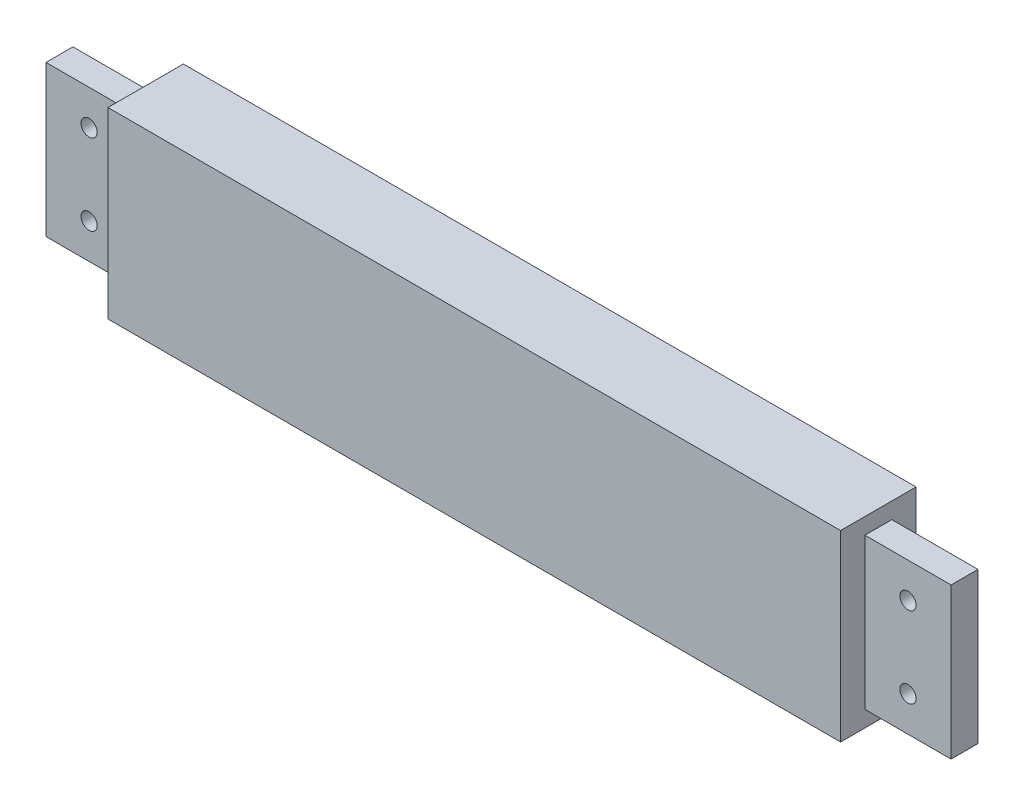
ISO-10303-21;
HEADER;
FILE_DESCRIPTION(('STEP AP214'),'2;1');
FILE_NAME('part.step','',(''),(''),'','','');
FILE_SCHEMA(('AUTOMOTIVE_DESIGN { 1 0 10303 214 1 1 1 1 }'));
ENDSEC;
DATA;
#1=APPLICATION_CONTEXT('core data for automotive mechanical design processes');
#2=APPLICATION_PROTOCOL_DEFINITION('international standard','automotive_design',2000,#1);
#3=PRODUCT_CONTEXT('',#1,'mechanical');
#4=PRODUCT('Part','Part','',(#3));
#5=PRODUCT_RELATED_PRODUCT_CATEGORY('part','',(#4));
#6=PRODUCT_DEFINITION_FORMATION('','',#4);
#7=PRODUCT_DEFINITION_CONTEXT('part definition',#1,'design');
#8=PRODUCT_DEFINITION('design','',#6,#7);
#9=PRODUCT_DEFINITION_SHAPE('','',#8);
#10=(LENGTH_UNIT() NAMED_UNIT(*) SI_UNIT(.MILLI.,.METRE.));
#11=(NAMED_UNIT(*) PLANE_ANGLE_UNIT() SI_UNIT($,.RADIAN.));
#12=(NAMED_UNIT(*) SI_UNIT($,.STERADIAN.) SOLID_ANGLE_UNIT());
#13=UNCERTAINTY_MEASURE_WITH_UNIT(LENGTH_MEASURE(1.E-05),#10,'distance_accuracy_value','');
#14=(GEOMETRIC_REPRESENTATION_CONTEXT(3) GLOBAL_UNCERTAINTY_ASSIGNED_CONTEXT((#13)) GLOBAL_UNIT_ASSIGNED_CONTEXT((#10,
#11,#12)) REPRESENTATION_CONTEXT('',''));
#15=CARTESIAN_POINT('',(0.,0.,0.));
#16=DIRECTION('',(0.,0.,1.));
#17=DIRECTION('',(1.,0.,0.));
#18=AXIS2_PLACEMENT_3D('',#15,#16,#17);
#19=CARTESIAN_POINT('',(0.,0.,-22.225));
#20=DIRECTION('',(0.,0.,-1.));
#21=DIRECTION('',(-1.,0.,0.));
#22=AXIS2_PLACEMENT_3D('',#19,#20,#21);
#23=PLANE('',#22);
#24=DIRECTION('',(1.,0.,0.));
#25=VECTOR('',#24,1.);
#26=CARTESIAN_POINT('',(-215.9,19.05,-22.225));
#27=LINE('',#26,#25);
#28=CARTESIAN_POINT('',(-215.9,19.05,-22.225));
#29=VERTEX_POINT('',#28);
#30=CARTESIAN_POINT('',(215.9,19.05,-22.225));
#31=VERTEX_POINT('',#30);
#32=EDGE_CURVE('E207',#29,#31,#27,.T.);
#33=ORIENTED_EDGE('',*,*,#32,.T.);
#34=DIRECTION('',(0.,1.,0.));
#35=VECTOR('',#34,1.);
#36=CARTESIAN_POINT('',(215.9,53.975,-22.225));
#37=LINE('',#36,#35);
#38=CARTESIAN_POINT('',(215.9,-53.975,-22.225));
#39=VERTEX_POINT('',#38);
#40=EDGE_CURVE('E272',#39,#31,#37,.T.);
#41=ORIENTED_EDGE('',*,*,#40,.F.);
#42=DIRECTION('',(1.,0.,0.));
#43=VECTOR('',#42,1.);
#44=CARTESIAN_POINT('',(215.9,-53.975,-22.225));
#45=LINE('',#44,#43);
#46=CARTESIAN_POINT('',(-215.9,-53.975,-22.225));
#47=VERTEX_POINT('',#46);
#48=EDGE_CURVE('E269',#47,#39,#45,.T.);
#49=ORIENTED_EDGE('',*,*,#48,.F.);
#50=DIRECTION('',(0.,-1.,0.));
#51=VECTOR('',#50,1.);
#52=CARTESIAN_POINT('',(-215.9,53.975,-22.225));
#53=LINE('',#52,#51);
#54=EDGE_CURVE('E254',#29,#47,#53,.T.);
#55=ORIENTED_EDGE('',*,*,#54,.F.);
#56=EDGE_LOOP('',(#33,#41,#49,#55));
#57=FACE_BOUND('',#56,.T.);
#58=ADVANCED_FACE('F33',(#57),#23,.T.);
#59=CARTESIAN_POINT('',(215.9,53.975,22.225));
#60=DIRECTION('',(-1.,0.,0.));
#61=DIRECTION('',(0.,0.,1.));
#62=AXIS2_PLACEMENT_3D('',#59,#60,#61);
#63=PLANE('',#62);
#64=ORIENTED_EDGE('',*,*,#40,.T.);
#65=DIRECTION('',(0.,0.,-1.));
#66=VECTOR('',#65,1.);
#67=CARTESIAN_POINT('',(215.9,19.05,-19.05));
#68=LINE('',#67,#66);
#69=CARTESIAN_POINT('',(215.9,19.05,-19.05));
#70=VERTEX_POINT('',#69);
#71=EDGE_CURVE('E194',#70,#31,#68,.T.);
#72=ORIENTED_EDGE('',*,*,#71,.F.);
#73=DIRECTION('',(0.,-1.,0.));
#74=VECTOR('',#73,1.);
#75=CARTESIAN_POINT('',(215.9,28.575,-19.05));
#76=LINE('',#75,#74);
#77=CARTESIAN_POINT('',(215.9,28.575,-19.05));
#78=VERTEX_POINT('',#77);
#79=EDGE_CURVE('E203',#78,#70,#76,.T.);
#80=ORIENTED_EDGE('',*,*,#79,.F.);
#81=DIRECTION('',(0.,0.,1.));
#82=VECTOR('',#81,1.);
#83=CARTESIAN_POINT('',(215.9,28.575,-22.225));
#84=LINE('',#83,#82);
#85=CARTESIAN_POINT('',(215.9,28.575,-22.225));
#86=VERTEX_POINT('',#85);
#87=EDGE_CURVE('E160',#86,#78,#84,.T.);
#88=ORIENTED_EDGE('',*,*,#87,.F.);
#89=CARTESIAN_POINT('',(215.9,53.975,-22.225));
#90=VERTEX_POINT('',#89);
#91=EDGE_CURVE('E271',#86,#90,#37,.T.);
#92=ORIENTED_EDGE('',*,*,#91,.T.);
#93=DIRECTION('',(0.,0.,-1.));
#94=VECTOR('',#93,1.);
#95=CARTESIAN_POINT('',(215.9,53.975,22.225));
#96=LINE('',#95,#94);
#97=CARTESIAN_POINT('',(215.9,53.975,22.225));
#98=VERTEX_POINT('',#97);
#99=EDGE_CURVE('E278',#98,#90,#96,.T.);
#100=ORIENTED_EDGE('',*,*,#99,.F.);
#101=DIRECTION('',(0.,1.,0.));
#102=VECTOR('',#101,1.);
#103=CARTESIAN_POINT('',(215.9,53.975,22.225));
#104=LINE('',#103,#102);
#105=CARTESIAN_POINT('',(215.9,-53.975,22.225));
#106=VERTEX_POINT('',#105);
#107=EDGE_CURVE('E261',#106,#98,#104,.T.);
#108=ORIENTED_EDGE('',*,*,#107,.F.);
#109=DIRECTION('',(0.,0.,-1.));
#110=VECTOR('',#109,1.);
#111=CARTESIAN_POINT('',(215.9,-53.975,22.225));
#112=LINE('',#111,#110);
#113=EDGE_CURVE('E42',#106,#39,#112,.T.);
#114=ORIENTED_EDGE('',*,*,#113,.T.);
#115=EDGE_LOOP('',(#64,#72,#80,#88,#92,#100,#108,#114));
#116=FACE_BOUND('',#115,.T.);
#117=DIRECTION('',(0.,0.,1.));
#118=VECTOR('',#117,1.);
#119=CARTESIAN_POINT('',(215.9,44.45,-7.9375));
#120=LINE('',#119,#118);
#121=CARTESIAN_POINT('',(215.9,44.45,-7.9375));
#122=VERTEX_POINT('',#121);
#123=CARTESIAN_POINT('',(215.9,44.45,7.9375));
#124=VERTEX_POINT('',#123);
#125=EDGE_CURVE('E235',#122,#124,#120,.T.);
#126=ORIENTED_EDGE('',*,*,#125,.F.);
#127=DIRECTION('',(0.,-1.,0.));
#128=VECTOR('',#127,1.);
#129=CARTESIAN_POINT('',(215.9,44.45,-7.9375));
#130=LINE('',#129,#128);
#131=CARTESIAN_POINT('',(215.9,-44.45,-7.93750000000001));
#132=VERTEX_POINT('',#131);
#133=EDGE_CURVE('E226',#122,#132,#130,.T.);
#134=ORIENTED_EDGE('',*,*,#133,.T.);
#135=DIRECTION('',(0.,0.,1.));
#136=VECTOR('',#135,1.);
#137=CARTESIAN_POINT('',(215.9,-44.45,-7.93750000000001));
#138=LINE('',#137,#136);
#139=CARTESIAN_POINT('',(215.9,-44.45,7.93749999999999));
#140=VERTEX_POINT('',#139);
#141=EDGE_CURVE('E241',#132,#140,#138,.T.);
#142=ORIENTED_EDGE('',*,*,#141,.T.);
#143=DIRECTION('',(0.,-1.,0.));
#144=VECTOR('',#143,1.);
#145=CARTESIAN_POINT('',(215.9,44.45,7.9375));
#146=LINE('',#145,#144);
#147=EDGE_CURVE('E238',#124,#140,#146,.T.);
#148=ORIENTED_EDGE('',*,*,#147,.F.);
#149=EDGE_LOOP('',(#126,#134,#142,#148));
#150=FACE_BOUND('',#149,.T.);
#151=ADVANCED_FACE('F300',(#116,#150),#63,.F.);
#152=CARTESIAN_POINT('',(-215.9,53.975,22.225));
#153=DIRECTION('',(1.,0.,0.));
#154=DIRECTION('',(0.,0.,-1.));
#155=AXIS2_PLACEMENT_3D('',#152,#153,#154);
#156=PLANE('',#155);
#157=DIRECTION('',(0.,-1.,0.));
#158=VECTOR('',#157,1.);
#159=CARTESIAN_POINT('',(-215.9,44.45,-7.9375));
#160=LINE('',#159,#158);
#161=CARTESIAN_POINT('',(-215.9,44.45,-7.9375));
#162=VERTEX_POINT('',#161);
#163=CARTESIAN_POINT('',(-215.9,-44.45,-7.93750000000001));
#164=VERTEX_POINT('',#163);
#165=EDGE_CURVE('E185',#162,#164,#160,.T.);
#166=ORIENTED_EDGE('',*,*,#165,.F.);
#167=DIRECTION('',(0.,0.,1.));
#168=VECTOR('',#167,1.);
#169=CARTESIAN_POINT('',(-215.9,44.45,-7.9375));
#170=LINE('',#169,#168);
#171=CARTESIAN_POINT('',(-215.9,44.45,7.9375));
#172=VERTEX_POINT('',#171);
#173=EDGE_CURVE('E157',#162,#172,#170,.T.);
#174=ORIENTED_EDGE('',*,*,#173,.T.);
#175=DIRECTION('',(0.,-1.,0.));
#176=VECTOR('',#175,1.);
#177=CARTESIAN_POINT('',(-215.9,44.45,7.9375));
#178=LINE('',#177,#176);
#179=CARTESIAN_POINT('',(-215.9,-44.45,7.93749999999999));
#180=VERTEX_POINT('',#179);
#181=EDGE_CURVE('E173',#172,#180,#178,.T.);
#182=ORIENTED_EDGE('',*,*,#181,.T.);
#183=DIRECTION('',(0.,0.,1.));
#184=VECTOR('',#183,1.);
#185=CARTESIAN_POINT('',(-215.9,-44.45,-7.93750000000001));
#186=LINE('',#185,#184);
#187=EDGE_CURVE('E50',#164,#180,#186,.T.);
#188=ORIENTED_EDGE('',*,*,#187,.F.);
#189=EDGE_LOOP('',(#166,#174,#182,#188));
#190=FACE_BOUND('',#189,.T.);
#191=DIRECTION('',(0.,-1.,0.));
#192=VECTOR('',#191,1.);
#193=CARTESIAN_POINT('',(-215.9,28.575,-19.05));
#194=LINE('',#193,#192);
#195=CARTESIAN_POINT('',(-215.9,28.575,-19.05));
#196=VERTEX_POINT('',#195);
#197=CARTESIAN_POINT('',(-215.9,19.05,-19.05));
#198=VERTEX_POINT('',#197);
#199=EDGE_CURVE('E193',#196,#198,#194,.T.);
#200=ORIENTED_EDGE('',*,*,#199,.T.);
#201=DIRECTION('',(0.,0.,-1.));
#202=VECTOR('',#201,1.);
#203=CARTESIAN_POINT('',(-215.9,19.05,-19.05));
#204=LINE('',#203,#202);
#205=EDGE_CURVE('E197',#198,#29,#204,.T.);
#206=ORIENTED_EDGE('',*,*,#205,.T.);
#207=ORIENTED_EDGE('',*,*,#54,.T.);
#208=DIRECTION('',(0.,0.,-1.));
#209=VECTOR('',#208,1.);
#210=CARTESIAN_POINT('',(-215.9,-53.975,22.225));
#211=LINE('',#210,#209);
#212=CARTESIAN_POINT('',(-215.9,-53.975,22.225));
#213=VERTEX_POINT('',#212);
#214=EDGE_CURVE('E11',#213,#47,#211,.T.);
#215=ORIENTED_EDGE('',*,*,#214,.F.);
#216=DIRECTION('',(0.,-1.,0.));
#217=VECTOR('',#216,1.);
#218=CARTESIAN_POINT('',(-215.9,53.975,22.225));
#219=LINE('',#218,#217);
#220=CARTESIAN_POINT('',(-215.9,53.975,22.225));
#221=VERTEX_POINT('',#220);
#222=EDGE_CURVE('E255',#221,#213,#219,.T.);
#223=ORIENTED_EDGE('',*,*,#222,.F.);
#224=DIRECTION('',(0.,0.,-1.));
#225=VECTOR('',#224,1.);
#226=CARTESIAN_POINT('',(-215.9,53.975,22.225));
#227=LINE('',#226,#225);
#228=CARTESIAN_POINT('',(-215.9,53.975,-22.225));
#229=VERTEX_POINT('',#228);
#230=EDGE_CURVE('E265',#221,#229,#227,.T.);
#231=ORIENTED_EDGE('',*,*,#230,.T.);
#232=CARTESIAN_POINT('',(-215.9,28.575,-22.225));
#233=VERTEX_POINT('',#232);
#234=EDGE_CURVE('E266',#229,#233,#53,.T.);
#235=ORIENTED_EDGE('',*,*,#234,.T.);
#236=DIRECTION('',(0.,0.,1.));
#237=VECTOR('',#236,1.);
#238=CARTESIAN_POINT('',(-215.9,28.575,-22.225));
#239=LINE('',#238,#237);
#240=EDGE_CURVE('E58',#233,#196,#239,.T.);
#241=ORIENTED_EDGE('',*,*,#240,.T.);
#242=EDGE_LOOP('',(#200,#206,#207,#215,#223,#231,#235,#241));
#243=FACE_BOUND('',#242,.T.);
#244=ADVANCED_FACE('F35',(#190,#243),#156,.F.);
#245=CARTESIAN_POINT('',(215.9,-53.975,22.225));
#246=DIRECTION('',(0.,1.,0.));
#247=DIRECTION('',(-1.,0.,0.));
#248=AXIS2_PLACEMENT_3D('',#245,#246,#247);
#249=PLANE('',#248);
#250=ORIENTED_EDGE('',*,*,#48,.T.);
#251=ORIENTED_EDGE('',*,*,#113,.F.);
#252=DIRECTION('',(1.,0.,0.));
#253=VECTOR('',#252,1.);
#254=CARTESIAN_POINT('',(215.9,-53.975,22.225));
#255=LINE('',#254,#253);
#256=EDGE_CURVE('E258',#213,#106,#255,.T.);
#257=ORIENTED_EDGE('',*,*,#256,.F.);
#258=ORIENTED_EDGE('',*,*,#214,.T.);
#259=EDGE_LOOP('',(#250,#251,#257,#258));
#260=FACE_BOUND('',#259,.T.);
#261=ADVANCED_FACE('F366',(#260),#249,.F.);
#262=CARTESIAN_POINT('',(215.9,53.975,22.225));
#263=DIRECTION('',(0.,-1.,0.));
#264=DIRECTION('',(1.,0.,0.));
#265=AXIS2_PLACEMENT_3D('',#262,#263,#264);
#266=PLANE('',#265);
#267=DIRECTION('',(-1.,0.,0.));
#268=VECTOR('',#267,1.);
#269=CARTESIAN_POINT('',(215.9,53.975,-22.225));
#270=LINE('',#269,#268);
#271=EDGE_CURVE('E259',#90,#229,#270,.T.);
#272=ORIENTED_EDGE('',*,*,#271,.T.);
#273=ORIENTED_EDGE('',*,*,#230,.F.);
#274=DIRECTION('',(-1.,0.,0.));
#275=VECTOR('',#274,1.);
#276=CARTESIAN_POINT('',(215.9,53.975,22.225));
#277=LINE('',#276,#275);
#278=EDGE_CURVE('E263',#98,#221,#277,.T.);
#279=ORIENTED_EDGE('',*,*,#278,.F.);
#280=ORIENTED_EDGE('',*,*,#99,.T.);
#281=EDGE_LOOP('',(#272,#273,#279,#280));
#282=FACE_BOUND('',#281,.T.);
#283=ADVANCED_FACE('F339',(#282),#266,.F.);
#284=CARTESIAN_POINT('',(0.,0.,22.225));
#285=DIRECTION('',(0.,0.,-1.));
#286=DIRECTION('',(-1.,0.,0.));
#287=AXIS2_PLACEMENT_3D('',#284,#285,#286);
#288=PLANE('',#287);
#289=ORIENTED_EDGE('',*,*,#222,.T.);
#290=ORIENTED_EDGE('',*,*,#256,.T.);
#291=ORIENTED_EDGE('',*,*,#107,.T.);
#292=ORIENTED_EDGE('',*,*,#278,.T.);
#293=EDGE_LOOP('',(#289,#290,#291,#292));
#294=FACE_BOUND('',#293,.T.);
#295=ADVANCED_FACE('F334',(#294),#288,.F.);
#296=DIRECTION('',(1.,0.,0.));
#297=VECTOR('',#296,1.);
#298=CARTESIAN_POINT('',(-215.9,28.575,-22.225));
#299=LINE('',#298,#297);
#300=EDGE_CURVE('E200',#233,#86,#299,.T.);
#301=ORIENTED_EDGE('',*,*,#300,.F.);
#302=ORIENTED_EDGE('',*,*,#234,.F.);
#303=ORIENTED_EDGE('',*,*,#271,.F.);
#304=ORIENTED_EDGE('',*,*,#91,.F.);
#305=EDGE_LOOP('',(#301,#302,#303,#304));
#306=FACE_BOUND('',#305,.T.);
#307=ADVANCED_FACE('F319',(#306),#23,.T.);
#308=CARTESIAN_POINT('',(266.7,44.45,-7.9375));
#309=DIRECTION('',(0.,-1.,0.));
#310=DIRECTION('',(0.,0.,-1.));
#311=AXIS2_PLACEMENT_3D('',#308,#309,#310);
#312=PLANE('',#311);
#313=ORIENTED_EDGE('',*,*,#125,.T.);
#314=DIRECTION('',(-1.,0.,0.));
#315=VECTOR('',#314,1.);
#316=CARTESIAN_POINT('',(266.7,44.45,7.9375));
#317=LINE('',#316,#315);
#318=CARTESIAN_POINT('',(266.7,44.45,7.9375));
#319=VERTEX_POINT('',#318);
#320=EDGE_CURVE('E252',#319,#124,#317,.T.);
#321=ORIENTED_EDGE('',*,*,#320,.F.);
#322=DIRECTION('',(0.,0.,1.));
#323=VECTOR('',#322,1.);
#324=CARTESIAN_POINT('',(266.7,44.45,-7.9375));
#325=LINE('',#324,#323);
#326=CARTESIAN_POINT('',(266.7,44.45,-7.9375));
#327=VERTEX_POINT('',#326);
#328=EDGE_CURVE('E222',#327,#319,#325,.T.);
#329=ORIENTED_EDGE('',*,*,#328,.F.);
#330=DIRECTION('',(-1.,0.,0.));
#331=VECTOR('',#330,1.);
#332=CARTESIAN_POINT('',(266.7,44.45,-7.9375));
#333=LINE('',#332,#331);
#334=EDGE_CURVE('E234',#327,#122,#333,.T.);
#335=ORIENTED_EDGE('',*,*,#334,.T.);
#336=EDGE_LOOP('',(#313,#321,#329,#335));
#337=FACE_BOUND('',#336,.T.);
#338=ADVANCED_FACE('F303',(#337),#312,.F.);
#339=CARTESIAN_POINT('',(266.7,44.45,7.9375));
#340=DIRECTION('',(0.,0.,-1.));
#341=DIRECTION('',(0.,1.,0.));
#342=AXIS2_PLACEMENT_3D('',#339,#340,#341);
#343=PLANE('',#342);
#344=CARTESIAN_POINT('',(241.3,-23.8125,7.9375));
#345=DIRECTION('',(0.,0.,1.));
#346=DIRECTION('',(1.,0.,0.));
#347=AXIS2_PLACEMENT_3D('',#344,#345,#346);
#348=CIRCLE('',#347,4.76250000000001);
#349=CARTESIAN_POINT('',(246.0625,-23.8125,7.9375));
#350=VERTEX_POINT('',#349);
#351=EDGE_CURVE('E210',#350,#350,#348,.T.);
#352=ORIENTED_EDGE('',*,*,#351,.F.);
#353=EDGE_LOOP('',(#352));
#354=FACE_BOUND('',#353,.T.);
#355=CARTESIAN_POINT('',(241.3,23.8125,7.9375));
#356=DIRECTION('',(0.,0.,1.));
#357=DIRECTION('',(1.,0.,0.));
#358=AXIS2_PLACEMENT_3D('',#355,#356,#357);
#359=CIRCLE('',#358,4.76250000000001);
#360=CARTESIAN_POINT('',(246.0625,23.8125,7.9375));
#361=VERTEX_POINT('',#360);
#362=EDGE_CURVE('E218',#361,#361,#359,.T.);
#363=ORIENTED_EDGE('',*,*,#362,.F.);
#364=EDGE_LOOP('',(#363));
#365=FACE_BOUND('',#364,.T.);
#366=ORIENTED_EDGE('',*,*,#147,.T.);
#367=DIRECTION('',(-1.,0.,0.));
#368=VECTOR('',#367,1.);
#369=CARTESIAN_POINT('',(266.7,-44.45,7.93749999999999));
#370=LINE('',#369,#368);
#371=CARTESIAN_POINT('',(266.7,-44.45,7.93749999999999));
#372=VERTEX_POINT('',#371);
#373=EDGE_CURVE('E250',#372,#140,#370,.T.);
#374=ORIENTED_EDGE('',*,*,#373,.F.);
#375=DIRECTION('',(0.,-1.,0.));
#376=VECTOR('',#375,1.);
#377=CARTESIAN_POINT('',(266.7,44.45,7.9375));
#378=LINE('',#377,#376);
#379=EDGE_CURVE('E225',#319,#372,#378,.T.);
#380=ORIENTED_EDGE('',*,*,#379,.F.);
#381=ORIENTED_EDGE('',*,*,#320,.T.);
#382=EDGE_LOOP('',(#366,#374,#380,#381));
#383=FACE_BOUND('',#382,.T.);
#384=ADVANCED_FACE('F310',(#354,#365,#383),#343,.F.);
#385=CARTESIAN_POINT('',(266.7,-44.45,-7.93750000000001));
#386=DIRECTION('',(0.,-1.,0.));
#387=DIRECTION('',(0.,0.,-1.));
#388=AXIS2_PLACEMENT_3D('',#385,#386,#387);
#389=PLANE('',#388);
#390=ORIENTED_EDGE('',*,*,#141,.F.);
#391=DIRECTION('',(-1.,0.,0.));
#392=VECTOR('',#391,1.);
#393=CARTESIAN_POINT('',(266.7,-44.45,-7.93750000000001));
#394=LINE('',#393,#392);
#395=CARTESIAN_POINT('',(266.7,-44.45,-7.93750000000001));
#396=VERTEX_POINT('',#395);
#397=EDGE_CURVE('E247',#396,#132,#394,.T.);
#398=ORIENTED_EDGE('',*,*,#397,.F.);
#399=DIRECTION('',(0.,0.,1.));
#400=VECTOR('',#399,1.);
#401=CARTESIAN_POINT('',(266.7,-44.45,-7.93750000000001));
#402=LINE('',#401,#400);
#403=EDGE_CURVE('E228',#396,#372,#402,.T.);
#404=ORIENTED_EDGE('',*,*,#403,.T.);
#405=ORIENTED_EDGE('',*,*,#373,.T.);
#406=EDGE_LOOP('',(#390,#398,#404,#405));
#407=FACE_BOUND('',#406,.T.);
#408=ADVANCED_FACE('F292',(#407),#389,.T.);
#409=CARTESIAN_POINT('',(266.7,44.45,-7.9375));
#410=DIRECTION('',(0.,0.,-1.));
#411=DIRECTION('',(0.,1.,0.));
#412=AXIS2_PLACEMENT_3D('',#409,#410,#411);
#413=PLANE('',#412);
#414=CARTESIAN_POINT('',(241.3,-23.8125,-7.93750000000001));
#415=DIRECTION('',(0.,0.,-1.));
#416=DIRECTION('',(0.,1.,0.));
#417=AXIS2_PLACEMENT_3D('',#414,#415,#416);
#418=CIRCLE('',#417,4.76250000000001);
#419=CARTESIAN_POINT('',(241.3,-19.05,-7.93750000000001));
#420=VERTEX_POINT('',#419);
#421=EDGE_CURVE('E37',#420,#420,#418,.T.);
#422=ORIENTED_EDGE('',*,*,#421,.F.);
#423=EDGE_LOOP('',(#422));
#424=FACE_BOUND('',#423,.T.);
#425=CARTESIAN_POINT('',(241.3,23.8125,-7.9375));
#426=DIRECTION('',(0.,0.,-1.));
#427=DIRECTION('',(0.,1.,0.));
#428=AXIS2_PLACEMENT_3D('',#425,#426,#427);
#429=CIRCLE('',#428,4.76250000000001);
#430=CARTESIAN_POINT('',(241.3,28.575,-7.9375));
#431=VERTEX_POINT('',#430);
#432=EDGE_CURVE('E221',#431,#431,#429,.T.);
#433=ORIENTED_EDGE('',*,*,#432,.F.);
#434=EDGE_LOOP('',(#433));
#435=FACE_BOUND('',#434,.T.);
#436=ORIENTED_EDGE('',*,*,#133,.F.);
#437=ORIENTED_EDGE('',*,*,#334,.F.);
#438=DIRECTION('',(0.,-1.,0.));
#439=VECTOR('',#438,1.);
#440=CARTESIAN_POINT('',(266.7,44.45,-7.9375));
#441=LINE('',#440,#439);
#442=EDGE_CURVE('E231',#327,#396,#441,.T.);
#443=ORIENTED_EDGE('',*,*,#442,.T.);
#444=ORIENTED_EDGE('',*,*,#397,.T.);
#445=EDGE_LOOP('',(#436,#437,#443,#444));
#446=FACE_BOUND('',#445,.T.);
#447=ADVANCED_FACE('F288',(#424,#435,#446),#413,.T.);
#448=CARTESIAN_POINT('',(266.7,0.,0.));
#449=DIRECTION('',(1.,0.,0.));
#450=DIRECTION('',(0.,0.,-1.));
#451=AXIS2_PLACEMENT_3D('',#448,#449,#450);
#452=PLANE('',#451);
#453=ORIENTED_EDGE('',*,*,#328,.T.);
#454=ORIENTED_EDGE('',*,*,#379,.T.);
#455=ORIENTED_EDGE('',*,*,#403,.F.);
#456=ORIENTED_EDGE('',*,*,#442,.F.);
#457=EDGE_LOOP('',(#453,#454,#455,#456));
#458=FACE_BOUND('',#457,.T.);
#459=ADVANCED_FACE('F291',(#458),#452,.T.);
#460=CARTESIAN_POINT('',(241.3,23.8125,-22.225));
#461=DIRECTION('',(0.,0.,1.));
#462=DIRECTION('',(1.,0.,0.));
#463=AXIS2_PLACEMENT_3D('',#460,#461,#462);
#464=CYLINDRICAL_SURFACE('',#463,4.76250000000001);
#465=ORIENTED_EDGE('',*,*,#432,.T.);
#466=EDGE_LOOP('',(#465));
#467=FACE_BOUND('',#466,.T.);
#468=ORIENTED_EDGE('',*,*,#362,.T.);
#469=EDGE_LOOP('',(#468));
#470=FACE_BOUND('',#469,.T.);
#471=ADVANCED_FACE('F285',(#467,#470),#464,.F.);
#472=CARTESIAN_POINT('',(241.3,-23.8125,-22.225));
#473=DIRECTION('',(0.,0.,1.));
#474=DIRECTION('',(1.,0.,0.));
#475=AXIS2_PLACEMENT_3D('',#472,#473,#474);
#476=CYLINDRICAL_SURFACE('',#475,4.76250000000001);
#477=ORIENTED_EDGE('',*,*,#421,.T.);
#478=EDGE_LOOP('',(#477));
#479=FACE_BOUND('',#478,.T.);
#480=ORIENTED_EDGE('',*,*,#351,.T.);
#481=EDGE_LOOP('',(#480));
#482=FACE_BOUND('',#481,.T.);
#483=ADVANCED_FACE('F369',(#479,#482),#476,.F.);
#484=CARTESIAN_POINT('',(-215.9,19.05,-19.05));
#485=DIRECTION('',(0.,-1.,0.));
#486=DIRECTION('',(0.,0.,-1.));
#487=AXIS2_PLACEMENT_3D('',#484,#485,#486);
#488=PLANE('',#487);
#489=ORIENTED_EDGE('',*,*,#71,.T.);
#490=ORIENTED_EDGE('',*,*,#32,.F.);
#491=ORIENTED_EDGE('',*,*,#205,.F.);
#492=DIRECTION('',(1.,0.,0.));
#493=VECTOR('',#492,1.);
#494=CARTESIAN_POINT('',(-215.9,19.05,-19.05));
#495=LINE('',#494,#493);
#496=EDGE_CURVE('E211',#198,#70,#495,.T.);
#497=ORIENTED_EDGE('',*,*,#496,.T.);
#498=EDGE_LOOP('',(#489,#490,#491,#497));
#499=FACE_BOUND('',#498,.T.);
#500=ADVANCED_FACE('F367',(#499),#488,.F.);
#501=CARTESIAN_POINT('',(-215.9,28.575,-19.05));
#502=DIRECTION('',(0.,0.,1.));
#503=DIRECTION('',(0.,-1.,0.));
#504=AXIS2_PLACEMENT_3D('',#501,#502,#503);
#505=PLANE('',#504);
#506=ORIENTED_EDGE('',*,*,#79,.T.);
#507=ORIENTED_EDGE('',*,*,#496,.F.);
#508=ORIENTED_EDGE('',*,*,#199,.F.);
#509=DIRECTION('',(1.,0.,0.));
#510=VECTOR('',#509,1.);
#511=CARTESIAN_POINT('',(-215.9,28.575,-19.05));
#512=LINE('',#511,#510);
#513=EDGE_CURVE('E213',#196,#78,#512,.T.);
#514=ORIENTED_EDGE('',*,*,#513,.T.);
#515=EDGE_LOOP('',(#506,#507,#508,#514));
#516=FACE_BOUND('',#515,.T.);
#517=ADVANCED_FACE('F358',(#516),#505,.F.);
#518=CARTESIAN_POINT('',(-215.9,28.575,-22.225));
#519=DIRECTION('',(0.,1.,0.));
#520=DIRECTION('',(0.,0.,1.));
#521=AXIS2_PLACEMENT_3D('',#518,#519,#520);
#522=PLANE('',#521);
#523=ORIENTED_EDGE('',*,*,#87,.T.);
#524=ORIENTED_EDGE('',*,*,#513,.F.);
#525=ORIENTED_EDGE('',*,*,#240,.F.);
#526=ORIENTED_EDGE('',*,*,#300,.T.);
#527=EDGE_LOOP('',(#523,#524,#525,#526));
#528=FACE_BOUND('',#527,.T.);
#529=ADVANCED_FACE('F355',(#528),#522,.F.);
#530=CARTESIAN_POINT('',(-266.7,44.45,-7.9375));
#531=DIRECTION('',(0.,1.,0.));
#532=DIRECTION('',(0.,0.,1.));
#533=AXIS2_PLACEMENT_3D('',#530,#531,#532);
#534=PLANE('',#533);
#535=ORIENTED_EDGE('',*,*,#173,.F.);
#536=DIRECTION('',(1.,0.,0.));
#537=VECTOR('',#536,1.);
#538=CARTESIAN_POINT('',(-266.7,44.45,-7.9375));
#539=LINE('',#538,#537);
#540=CARTESIAN_POINT('',(-266.7,44.45,-7.9375));
#541=VERTEX_POINT('',#540);
#542=EDGE_CURVE('E150',#541,#162,#539,.T.);
#543=ORIENTED_EDGE('',*,*,#542,.F.);
#544=DIRECTION('',(0.,0.,1.));
#545=VECTOR('',#544,1.);
#546=CARTESIAN_POINT('',(-266.7,44.45,-7.9375));
#547=LINE('',#546,#545);
#548=CARTESIAN_POINT('',(-266.7,44.45,7.9375));
#549=VERTEX_POINT('',#548);
#550=EDGE_CURVE('E154',#541,#549,#547,.T.);
#551=ORIENTED_EDGE('',*,*,#550,.T.);
#552=DIRECTION('',(1.,0.,0.));
#553=VECTOR('',#552,1.);
#554=CARTESIAN_POINT('',(-266.7,44.45,7.9375));
#555=LINE('',#554,#553);
#556=EDGE_CURVE('E183',#549,#172,#555,.T.);
#557=ORIENTED_EDGE('',*,*,#556,.T.);
#558=EDGE_LOOP('',(#535,#543,#551,#557));
#559=FACE_BOUND('',#558,.T.);
#560=ADVANCED_FACE('F152',(#559),#534,.T.);
#561=CARTESIAN_POINT('',(-266.7,44.45,-7.9375));
#562=DIRECTION('',(0.,0.,1.));
#563=DIRECTION('',(0.,-1.,0.));
#564=AXIS2_PLACEMENT_3D('',#561,#562,#563);
#565=PLANE('',#564);
#566=CARTESIAN_POINT('',(-241.3,-23.8125,-7.93750000000001));
#567=DIRECTION('',(0.,0.,1.));
#568=DIRECTION('',(0.,-1.,0.));
#569=AXIS2_PLACEMENT_3D('',#566,#567,#568);
#570=CIRCLE('',#569,4.76250000000001);
#571=CARTESIAN_POINT('',(-241.3,-28.575,-7.93750000000001));
#572=VERTEX_POINT('',#571);
#573=EDGE_CURVE('E513',#572,#572,#570,.F.);
#574=ORIENTED_EDGE('',*,*,#573,.F.);
#575=EDGE_LOOP('',(#574));
#576=FACE_BOUND('',#575,.T.);
#577=CARTESIAN_POINT('',(-241.3,23.8125,-7.9375));
#578=DIRECTION('',(0.,0.,1.));
#579=DIRECTION('',(0.,-1.,0.));
#580=AXIS2_PLACEMENT_3D('',#577,#578,#579);
#581=CIRCLE('',#580,4.76250000000001);
#582=CARTESIAN_POINT('',(-241.3,19.05,-7.9375));
#583=VERTEX_POINT('',#582);
#584=EDGE_CURVE('E178',#583,#583,#581,.F.);
#585=ORIENTED_EDGE('',*,*,#584,.F.);
#586=EDGE_LOOP('',(#585));
#587=FACE_BOUND('',#586,.T.);
#588=ORIENTED_EDGE('',*,*,#165,.T.);
#589=DIRECTION('',(1.,0.,0.));
#590=VECTOR('',#589,1.);
#591=CARTESIAN_POINT('',(-266.7,-44.45,-7.93750000000001));
#592=LINE('',#591,#590);
#593=CARTESIAN_POINT('',(-266.7,-44.45,-7.93750000000001));
#594=VERTEX_POINT('',#593);
#595=EDGE_CURVE('E161',#594,#164,#592,.T.);
#596=ORIENTED_EDGE('',*,*,#595,.F.);
#597=DIRECTION('',(0.,-1.,0.));
#598=VECTOR('',#597,1.);
#599=CARTESIAN_POINT('',(-266.7,44.45,-7.9375));
#600=LINE('',#599,#598);
#601=EDGE_CURVE('E164',#541,#594,#600,.T.);
#602=ORIENTED_EDGE('',*,*,#601,.F.);
#603=ORIENTED_EDGE('',*,*,#542,.T.);
#604=EDGE_LOOP('',(#588,#596,#602,#603));
#605=FACE_BOUND('',#604,.T.);
#606=ADVANCED_FACE('F165',(#576,#587,#605),#565,.F.);
#607=CARTESIAN_POINT('',(-266.7,-44.45,-7.93750000000001));
#608=DIRECTION('',(0.,1.,0.));
#609=DIRECTION('',(0.,0.,1.));
#610=AXIS2_PLACEMENT_3D('',#607,#608,#609);
#611=PLANE('',#610);
#612=ORIENTED_EDGE('',*,*,#187,.T.);
#613=DIRECTION('',(1.,0.,0.));
#614=VECTOR('',#613,1.);
#615=CARTESIAN_POINT('',(-266.7,-44.45,7.93749999999999));
#616=LINE('',#615,#614);
#617=CARTESIAN_POINT('',(-266.7,-44.45,7.93749999999999));
#618=VERTEX_POINT('',#617);
#619=EDGE_CURVE('E189',#618,#180,#616,.T.);
#620=ORIENTED_EDGE('',*,*,#619,.F.);
#621=DIRECTION('',(0.,0.,1.));
#622=VECTOR('',#621,1.);
#623=CARTESIAN_POINT('',(-266.7,-44.45,-7.93750000000001));
#624=LINE('',#623,#622);
#625=EDGE_CURVE('E168',#594,#618,#624,.T.);
#626=ORIENTED_EDGE('',*,*,#625,.F.);
#627=ORIENTED_EDGE('',*,*,#595,.T.);
#628=EDGE_LOOP('',(#612,#620,#626,#627));
#629=FACE_BOUND('',#628,.T.);
#630=ADVANCED_FACE('F457',(#629),#611,.F.);
#631=CARTESIAN_POINT('',(-266.7,44.45,7.9375));
#632=DIRECTION('',(0.,0.,1.));
#633=DIRECTION('',(0.,-1.,0.));
#634=AXIS2_PLACEMENT_3D('',#631,#632,#633);
#635=PLANE('',#634);
#636=CARTESIAN_POINT('',(-241.3,-23.8125,7.9375));
#637=DIRECTION('',(0.,0.,-1.));
#638=DIRECTION('',(-1.,0.,0.));
#639=AXIS2_PLACEMENT_3D('',#636,#637,#638);
#640=CIRCLE('',#639,4.76250000000001);
#641=CARTESIAN_POINT('',(-246.0625,-23.8125,7.9375));
#642=VERTEX_POINT('',#641);
#643=EDGE_CURVE('E510',#642,#642,#640,.T.);
#644=ORIENTED_EDGE('',*,*,#643,.T.);
#645=EDGE_LOOP('',(#644));
#646=FACE_BOUND('',#645,.T.);
#647=CARTESIAN_POINT('',(-241.3,23.8125,7.9375));
#648=DIRECTION('',(0.,0.,-1.));
#649=DIRECTION('',(-1.,0.,0.));
#650=AXIS2_PLACEMENT_3D('',#647,#648,#649);
#651=CIRCLE('',#650,4.76250000000001);
#652=CARTESIAN_POINT('',(-246.0625,23.8125,7.9375));
#653=VERTEX_POINT('',#652);
#654=EDGE_CURVE('E514',#653,#653,#651,.T.);
#655=ORIENTED_EDGE('',*,*,#654,.T.);
#656=EDGE_LOOP('',(#655));
#657=FACE_BOUND('',#656,.T.);
#658=ORIENTED_EDGE('',*,*,#181,.F.);
#659=ORIENTED_EDGE('',*,*,#556,.F.);
#660=DIRECTION('',(0.,-1.,0.));
#661=VECTOR('',#660,1.);
#662=CARTESIAN_POINT('',(-266.7,44.45,7.9375));
#663=LINE('',#662,#661);
#664=EDGE_CURVE('E172',#549,#618,#663,.T.);
#665=ORIENTED_EDGE('',*,*,#664,.T.);
#666=ORIENTED_EDGE('',*,*,#619,.T.);
#667=EDGE_LOOP('',(#658,#659,#665,#666));
#668=FACE_BOUND('',#667,.T.);
#669=ADVANCED_FACE('F466',(#646,#657,#668),#635,.T.);
#670=CARTESIAN_POINT('',(-266.7,0.,0.));
#671=DIRECTION('',(-1.,0.,0.));
#672=DIRECTION('',(0.,0.,-1.));
#673=AXIS2_PLACEMENT_3D('',#670,#671,#672);
#674=PLANE('',#673);
#675=ORIENTED_EDGE('',*,*,#550,.F.);
#676=ORIENTED_EDGE('',*,*,#601,.T.);
#677=ORIENTED_EDGE('',*,*,#625,.T.);
#678=ORIENTED_EDGE('',*,*,#664,.F.);
#679=EDGE_LOOP('',(#675,#676,#677,#678));
#680=FACE_BOUND('',#679,.T.);
#681=ADVANCED_FACE('F170',(#680),#674,.T.);
#682=CARTESIAN_POINT('',(-241.3,23.8125,-22.225));
#683=DIRECTION('',(0.,0.,1.));
#684=DIRECTION('',(1.,0.,0.));
#685=AXIS2_PLACEMENT_3D('',#682,#683,#684);
#686=CYLINDRICAL_SURFACE('',#685,4.76250000000001);
#687=ORIENTED_EDGE('',*,*,#654,.F.);
#688=EDGE_LOOP('',(#687));
#689=FACE_BOUND('',#688,.T.);
#690=ORIENTED_EDGE('',*,*,#584,.T.);
#691=EDGE_LOOP('',(#690));
#692=FACE_BOUND('',#691,.T.);
#693=ADVANCED_FACE('F484',(#689,#692),#686,.F.);
#694=CARTESIAN_POINT('',(-241.3,-23.8125,-22.225));
#695=DIRECTION('',(0.,0.,1.));
#696=DIRECTION('',(1.,0.,0.));
#697=AXIS2_PLACEMENT_3D('',#694,#695,#696);
#698=CYLINDRICAL_SURFACE('',#697,4.76250000000001);
#699=ORIENTED_EDGE('',*,*,#643,.F.);
#700=EDGE_LOOP('',(#699));
#701=FACE_BOUND('',#700,.T.);
#702=ORIENTED_EDGE('',*,*,#573,.T.);
#703=EDGE_LOOP('',(#702));
#704=FACE_BOUND('',#703,.T.);
#705=ADVANCED_FACE('F493',(#701,#704),#698,.F.);
#706=CLOSED_SHELL('',(#58,#151,#244,#261,#283,#295,#307,#338,#384,#408,#447,#459,#471,#483,#500,
#517,#529,#560,#606,#630,#669,#681,#693,#705));
#707=MANIFOLD_SOLID_BREP('B2',#706);
#708=ADVANCED_BREP_SHAPE_REPRESENTATION('',(#18,#707),#14);
#709=SHAPE_DEFINITION_REPRESENTATION(#9,#708);
ENDSEC;
END-ISO-10303-21;
